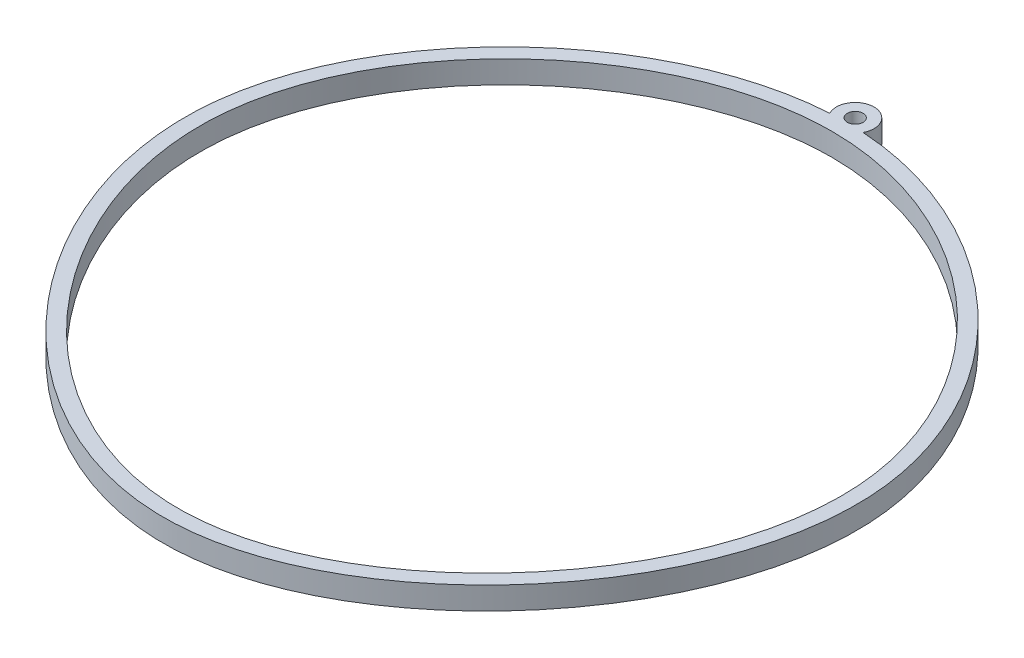
ISO-10303-21;
HEADER;
FILE_DESCRIPTION(('STEP AP214'),'2;1');
FILE_NAME('part.step','',(''),(''),'','','');
FILE_SCHEMA(('AUTOMOTIVE_DESIGN { 1 0 10303 214 1 1 1 1 }'));
ENDSEC;
DATA;
#1=APPLICATION_CONTEXT('core data for automotive mechanical design processes');
#2=APPLICATION_PROTOCOL_DEFINITION('international standard','automotive_design',2000,#1);
#3=PRODUCT_CONTEXT('',#1,'mechanical');
#4=PRODUCT('Part','Part','',(#3));
#5=PRODUCT_RELATED_PRODUCT_CATEGORY('part','',(#4));
#6=PRODUCT_DEFINITION_FORMATION('','',#4);
#7=PRODUCT_DEFINITION_CONTEXT('part definition',#1,'design');
#8=PRODUCT_DEFINITION('design','',#6,#7);
#9=PRODUCT_DEFINITION_SHAPE('','',#8);
#10=(LENGTH_UNIT() NAMED_UNIT(*) SI_UNIT(.MILLI.,.METRE.));
#11=(NAMED_UNIT(*) PLANE_ANGLE_UNIT() SI_UNIT($,.RADIAN.));
#12=(NAMED_UNIT(*) SI_UNIT($,.STERADIAN.) SOLID_ANGLE_UNIT());
#13=UNCERTAINTY_MEASURE_WITH_UNIT(LENGTH_MEASURE(1.E-05),#10,'distance_accuracy_value','');
#14=(GEOMETRIC_REPRESENTATION_CONTEXT(3) GLOBAL_UNCERTAINTY_ASSIGNED_CONTEXT((#13)) GLOBAL_UNIT_ASSIGNED_CONTEXT((#10,
#11,#12)) REPRESENTATION_CONTEXT('',''));
#15=CARTESIAN_POINT('',(0.,0.,0.));
#16=DIRECTION('',(0.,0.,1.));
#17=DIRECTION('',(1.,0.,0.));
#18=AXIS2_PLACEMENT_3D('',#15,#16,#17);
#19=CARTESIAN_POINT('',(0.,3.,-42.187));
#20=DIRECTION('',(0.,-1.,0.));
#21=DIRECTION('',(0.,0.,-1.));
#22=AXIS2_PLACEMENT_3D('',#19,#20,#21);
#23=CYLINDRICAL_SURFACE('',#22,2.49999999999999);
#24=CARTESIAN_POINT('',(0.,0.,-42.187));
#25=DIRECTION('',(0.,1.,0.));
#26=DIRECTION('',(0.,0.,1.));
#27=AXIS2_PLACEMENT_3D('',#24,#25,#26);
#28=CIRCLE('',#27,2.49999999999999);
#29=CARTESIAN_POINT('',(2.21048264558249,0.,-41.0191958753376));
#30=VERTEX_POINT('',#29);
#31=CARTESIAN_POINT('',(-2.21048264558249,0.,-41.0191958753376));
#32=VERTEX_POINT('',#31);
#33=EDGE_CURVE('E62',#30,#32,#28,.T.);
#34=ORIENTED_EDGE('',*,*,#33,.T.);
#35=DIRECTION('',(0.,-1.,0.));
#36=VECTOR('',#35,1.);
#37=CARTESIAN_POINT('',(-2.21048264558249,3.,-41.0191958753376));
#38=LINE('',#37,#36);
#39=CARTESIAN_POINT('',(-2.21048264558249,3.,-41.0191958753376));
#40=VERTEX_POINT('',#39);
#41=EDGE_CURVE('E11',#40,#32,#38,.T.);
#42=ORIENTED_EDGE('',*,*,#41,.F.);
#43=CARTESIAN_POINT('',(0.,3.,-42.187));
#44=DIRECTION('',(0.,1.,0.));
#45=DIRECTION('',(0.,0.,1.));
#46=AXIS2_PLACEMENT_3D('',#43,#44,#45);
#47=CIRCLE('',#46,2.49999999999999);
#48=CARTESIAN_POINT('',(2.21048264558249,3.,-41.0191958753376));
#49=VERTEX_POINT('',#48);
#50=EDGE_CURVE('E64',#49,#40,#47,.T.);
#51=ORIENTED_EDGE('',*,*,#50,.F.);
#52=DIRECTION('',(0.,-1.,0.));
#53=VECTOR('',#52,1.);
#54=CARTESIAN_POINT('',(2.21048264558249,3.,-41.0191958753376));
#55=LINE('',#54,#53);
#56=EDGE_CURVE('E46',#49,#30,#55,.T.);
#57=ORIENTED_EDGE('',*,*,#56,.T.);
#58=EDGE_LOOP('',(#34,#42,#51,#57));
#59=FACE_BOUND('',#58,.T.);
#60=ADVANCED_FACE('F37',(#59),#23,.T.);
#61=CARTESIAN_POINT('',(0.,3.,-41.087));
#62=CARTESIAN_POINT('',(21.5811981562524,3.,-41.087));
#63=CARTESIAN_POINT('',(66.9500443253071,3.,0.0657312662819072));
#64=CARTESIAN_POINT('',(0.,3.,75.8353558269367));
#65=CARTESIAN_POINT('',(-66.9500443253071,3.,0.0657312662819281));
#66=CARTESIAN_POINT('',(-21.5811981562524,3.,-41.087));
#67=CARTESIAN_POINT('',(0.,3.,-41.087));
#68=B_SPLINE_CURVE_WITH_KNOTS('',3,(#61,#62,#63,#64,#65,#66,#67),.UNSPECIFIED.,.T.,.F.,(4,1,1,1,
4),(0.,0.23784160253752,0.5,0.76215839746248,1.),.UNSPECIFIED.);
#69=DIRECTION('',(0.,-1.,0.));
#70=VECTOR('',#69,1.);
#71=SURFACE_OF_LINEAR_EXTRUSION('',#68,#70);
#72=CARTESIAN_POINT('',(0.,0.,-41.087));
#73=CARTESIAN_POINT('',(21.5811981562524,0.,-41.087));
#74=CARTESIAN_POINT('',(66.9500443253071,0.,0.0657312662819072));
#75=CARTESIAN_POINT('',(0.,0.,75.8353558269367));
#76=CARTESIAN_POINT('',(-66.9500443253071,0.,0.0657312662819281));
#77=CARTESIAN_POINT('',(-21.5811981562524,0.,-41.087));
#78=CARTESIAN_POINT('',(0.,0.,-41.087));
#79=B_SPLINE_CURVE_WITH_KNOTS('',3,(#72,#73,#74,#75,#76,#77,#78),.UNSPECIFIED.,.T.,.F.,(4,1,1,1,
4),(0.,0.23784160253752,0.5,0.76215839746248,1.),.UNSPECIFIED.);
#80=EDGE_CURVE('E70',#30,#32,#79,.T.);
#81=ORIENTED_EDGE('',*,*,#80,.F.);
#82=ORIENTED_EDGE('',*,*,#56,.F.);
#83=EDGE_CURVE('E97',#49,#40,#68,.T.);
#84=ORIENTED_EDGE('',*,*,#83,.T.);
#85=ORIENTED_EDGE('',*,*,#41,.T.);
#86=EDGE_LOOP('',(#81,#82,#84,#85));
#87=FACE_BOUND('',#86,.T.);
#88=ADVANCED_FACE('F73',(#87),#71,.T.);
#89=CARTESIAN_POINT('',(0.,3.,-42.187));
#90=DIRECTION('',(0.,-1.,0.));
#91=DIRECTION('',(0.,0.,-1.));
#92=AXIS2_PLACEMENT_3D('',#89,#90,#91);
#93=CYLINDRICAL_SURFACE('',#92,1.05);
#94=CARTESIAN_POINT('',(0.,3.,-42.187));
#95=DIRECTION('',(0.,1.,0.));
#96=DIRECTION('',(0.,0.,1.));
#97=AXIS2_PLACEMENT_3D('',#94,#95,#96);
#98=CIRCLE('',#97,1.05);
#99=CARTESIAN_POINT('',(0.,3.,-41.137));
#100=VERTEX_POINT('',#99);
#101=EDGE_CURVE('E77',#100,#100,#98,.T.);
#102=ORIENTED_EDGE('',*,*,#101,.T.);
#103=EDGE_LOOP('',(#102));
#104=FACE_BOUND('',#103,.T.);
#105=CARTESIAN_POINT('',(0.,0.,-42.187));
#106=DIRECTION('',(0.,1.,0.));
#107=DIRECTION('',(0.,0.,1.));
#108=AXIS2_PLACEMENT_3D('',#105,#106,#107);
#109=CIRCLE('',#108,1.05);
#110=CARTESIAN_POINT('',(0.,0.,-41.137));
#111=VERTEX_POINT('',#110);
#112=EDGE_CURVE('E71',#111,#111,#109,.T.);
#113=ORIENTED_EDGE('',*,*,#112,.F.);
#114=EDGE_LOOP('',(#113));
#115=FACE_BOUND('',#114,.T.);
#116=ADVANCED_FACE('F39',(#104,#115),#93,.F.);
#117=CARTESIAN_POINT('',(0.,3.,-39.087));
#118=CARTESIAN_POINT('',(20.5828494292914,3.,-39.087));
#119=CARTESIAN_POINT('',(63.9566281689656,3.,0.06780422785386));
#120=CARTESIAN_POINT('',(0.,3.,72.8398900928949));
#121=CARTESIAN_POINT('',(-63.9566281689656,3.,0.0678042278538896));
#122=CARTESIAN_POINT('',(-20.5828494292914,3.,-39.087));
#123=CARTESIAN_POINT('',(0.,3.,-39.087));
#124=B_SPLINE_CURVE_WITH_KNOTS('',3,(#117,#118,#119,#120,#121,#122,#123),.UNSPECIFIED.,.T.,.F.,
(4,1,1,1,4),(0.,0.237272956465563,0.5,0.762727043534437,1.),.UNSPECIFIED.);
#125=DIRECTION('',(0.,-1.,0.));
#126=VECTOR('',#125,1.);
#127=SURFACE_OF_LINEAR_EXTRUSION('',#124,#126);
#128=CARTESIAN_POINT('',(0.,3.,-39.087));
#129=VERTEX_POINT('',#128);
#130=EDGE_CURVE('E66',#129,#129,#124,.T.);
#131=ORIENTED_EDGE('',*,*,#130,.F.);
#132=EDGE_LOOP('',(#131));
#133=FACE_BOUND('',#132,.T.);
#134=CARTESIAN_POINT('',(0.,0.,-39.087));
#135=CARTESIAN_POINT('',(20.5828494292914,0.,-39.087));
#136=CARTESIAN_POINT('',(63.9566281689656,0.,0.06780422785386));
#137=CARTESIAN_POINT('',(0.,0.,72.8398900928949));
#138=CARTESIAN_POINT('',(-63.9566281689656,0.,0.0678042278538896));
#139=CARTESIAN_POINT('',(-20.5828494292914,0.,-39.087));
#140=CARTESIAN_POINT('',(0.,0.,-39.087));
#141=B_SPLINE_CURVE_WITH_KNOTS('',3,(#134,#135,#136,#137,#138,#139,#140),.UNSPECIFIED.,.T.,.F.,
(4,1,1,1,4),(0.,0.237272956465563,0.5,0.762727043534437,1.),.UNSPECIFIED.);
#142=CARTESIAN_POINT('',(0.,0.,-39.087));
#143=VERTEX_POINT('',#142);
#144=EDGE_CURVE('E74',#143,#143,#141,.T.);
#145=ORIENTED_EDGE('',*,*,#144,.T.);
#146=EDGE_LOOP('',(#145));
#147=FACE_BOUND('',#146,.T.);
#148=ADVANCED_FACE('F106',(#133,#147),#127,.F.);
#149=CARTESIAN_POINT('',(0.,3.,0.));
#150=DIRECTION('',(0.,1.,0.));
#151=DIRECTION('',(0.,0.,1.));
#152=AXIS2_PLACEMENT_3D('',#149,#150,#151);
#153=PLANE('',#152);
#154=ORIENTED_EDGE('',*,*,#101,.F.);
#155=EDGE_LOOP('',(#154));
#156=FACE_BOUND('',#155,.T.);
#157=ORIENTED_EDGE('',*,*,#50,.T.);
#158=ORIENTED_EDGE('',*,*,#83,.F.);
#159=EDGE_LOOP('',(#157,#158));
#160=FACE_BOUND('',#159,.T.);
#161=ORIENTED_EDGE('',*,*,#130,.T.);
#162=EDGE_LOOP('',(#161));
#163=FACE_BOUND('',#162,.T.);
#164=ADVANCED_FACE('F110',(#156,#160,#163),#153,.T.);
#165=CARTESIAN_POINT('',(0.,0.,0.));
#166=DIRECTION('',(0.,1.,0.));
#167=DIRECTION('',(0.,0.,1.));
#168=AXIS2_PLACEMENT_3D('',#165,#166,#167);
#169=PLANE('',#168);
#170=ORIENTED_EDGE('',*,*,#112,.T.);
#171=EDGE_LOOP('',(#170));
#172=FACE_BOUND('',#171,.T.);
#173=ORIENTED_EDGE('',*,*,#33,.F.);
#174=ORIENTED_EDGE('',*,*,#80,.T.);
#175=EDGE_LOOP('',(#173,#174));
#176=FACE_BOUND('',#175,.T.);
#177=ORIENTED_EDGE('',*,*,#144,.F.);
#178=EDGE_LOOP('',(#177));
#179=FACE_BOUND('',#178,.T.);
#180=ADVANCED_FACE('F68',(#172,#176,#179),#169,.F.);
#181=CLOSED_SHELL('',(#60,#88,#116,#148,#164,#180));
#182=MANIFOLD_SOLID_BREP('B2',#181);
#183=ADVANCED_BREP_SHAPE_REPRESENTATION('',(#18,#182),#14);
#184=SHAPE_DEFINITION_REPRESENTATION(#9,#183);
ENDSEC;
END-ISO-10303-21;
